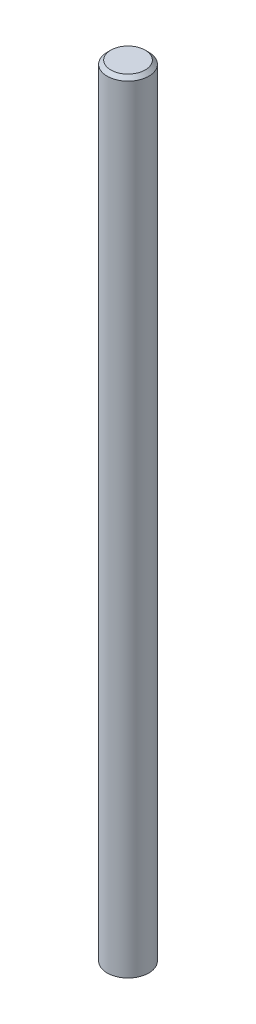
ISO-10303-21;
HEADER;
FILE_DESCRIPTION(('STEP AP214'),'2;1');
FILE_NAME('part.step','',(''),(''),'','','');
FILE_SCHEMA(('AUTOMOTIVE_DESIGN { 1 0 10303 214 1 1 1 1 }'));
ENDSEC;
DATA;
#1=APPLICATION_CONTEXT('core data for automotive mechanical design processes');
#2=APPLICATION_PROTOCOL_DEFINITION('international standard','automotive_design',2000,#1);
#3=PRODUCT_CONTEXT('',#1,'mechanical');
#4=PRODUCT('Part','Part','',(#3));
#5=PRODUCT_RELATED_PRODUCT_CATEGORY('part','',(#4));
#6=PRODUCT_DEFINITION_FORMATION('','',#4);
#7=PRODUCT_DEFINITION_CONTEXT('part definition',#1,'design');
#8=PRODUCT_DEFINITION('design','',#6,#7);
#9=PRODUCT_DEFINITION_SHAPE('','',#8);
#10=(LENGTH_UNIT() NAMED_UNIT(*) SI_UNIT(.MILLI.,.METRE.));
#11=(NAMED_UNIT(*) PLANE_ANGLE_UNIT() SI_UNIT($,.RADIAN.));
#12=(NAMED_UNIT(*) SI_UNIT($,.STERADIAN.) SOLID_ANGLE_UNIT());
#13=UNCERTAINTY_MEASURE_WITH_UNIT(LENGTH_MEASURE(1.E-05),#10,'distance_accuracy_value','');
#14=(GEOMETRIC_REPRESENTATION_CONTEXT(3) GLOBAL_UNCERTAINTY_ASSIGNED_CONTEXT((#13)) GLOBAL_UNIT_ASSIGNED_CONTEXT((#10,
#11,#12)) REPRESENTATION_CONTEXT('',''));
#15=CARTESIAN_POINT('',(0.,0.,0.));
#16=DIRECTION('',(0.,0.,1.));
#17=DIRECTION('',(1.,0.,0.));
#18=AXIS2_PLACEMENT_3D('',#15,#16,#17);
#19=CARTESIAN_POINT('',(0.,150.,0.));
#20=DIRECTION('',(0.,-1.,0.));
#21=DIRECTION('',(0.,0.,-1.));
#22=AXIS2_PLACEMENT_3D('',#19,#20,#21);
#23=CYLINDRICAL_SURFACE('',#22,4.);
#24=CARTESIAN_POINT('',(0.,149.3095,0.));
#25=DIRECTION('',(0.,-1.,0.));
#26=DIRECTION('',(0.,0.,-1.));
#27=AXIS2_PLACEMENT_3D('',#24,#25,#26);
#28=CIRCLE('',#27,4.);
#29=CARTESIAN_POINT('',(0.,149.3095,-4.));
#30=VERTEX_POINT('',#29);
#31=EDGE_CURVE('E47',#30,#30,#28,.T.);
#32=ORIENTED_EDGE('',*,*,#31,.T.);
#33=EDGE_LOOP('',(#32));
#34=FACE_BOUND('',#33,.T.);
#35=CARTESIAN_POINT('',(0.,0.,0.));
#36=DIRECTION('',(0.,1.,0.));
#37=DIRECTION('',(0.,0.,1.));
#38=AXIS2_PLACEMENT_3D('',#35,#36,#37);
#39=CIRCLE('',#38,4.);
#40=CARTESIAN_POINT('',(0.,0.,4.));
#41=VERTEX_POINT('',#40);
#42=EDGE_CURVE('E10',#41,#41,#39,.T.);
#43=ORIENTED_EDGE('',*,*,#42,.T.);
#44=EDGE_LOOP('',(#43));
#45=FACE_BOUND('',#44,.T.);
#46=ADVANCED_FACE('F41',(#34,#45),#23,.T.);
#47=CARTESIAN_POINT('',(0.,0.,0.));
#48=DIRECTION('',(0.,1.,0.));
#49=DIRECTION('',(0.,0.,1.));
#50=AXIS2_PLACEMENT_3D('',#47,#48,#49);
#51=PLANE('',#50);
#52=ORIENTED_EDGE('',*,*,#42,.F.);
#53=EDGE_LOOP('',(#52));
#54=FACE_BOUND('',#53,.T.);
#55=ADVANCED_FACE('F66',(#54),#51,.F.);
#56=CARTESIAN_POINT('',(0.,150.,0.));
#57=DIRECTION('',(0.,-1.,0.));
#58=DIRECTION('',(0.,0.,-1.));
#59=AXIS2_PLACEMENT_3D('',#56,#57,#58);
#60=CONICAL_SURFACE('',#59,3.3095,0.785398163397458);
#61=ORIENTED_EDGE('',*,*,#31,.F.);
#62=EDGE_LOOP('',(#61));
#63=FACE_BOUND('',#62,.T.);
#64=CARTESIAN_POINT('',(0.,150.,0.));
#65=DIRECTION('',(0.,-1.,0.));
#66=DIRECTION('',(0.,0.,-1.));
#67=AXIS2_PLACEMENT_3D('',#64,#65,#66);
#68=CIRCLE('',#67,3.3095);
#69=CARTESIAN_POINT('',(0.,150.,-3.3095));
#70=VERTEX_POINT('',#69);
#71=EDGE_CURVE('E51',#70,#70,#68,.T.);
#72=ORIENTED_EDGE('',*,*,#71,.T.);
#73=EDGE_LOOP('',(#72));
#74=FACE_BOUND('',#73,.T.);
#75=ADVANCED_FACE('F58',(#63,#74),#60,.T.);
#76=CARTESIAN_POINT('',(0.,150.,0.));
#77=DIRECTION('',(0.,1.,0.));
#78=DIRECTION('',(0.,0.,1.));
#79=AXIS2_PLACEMENT_3D('',#76,#77,#78);
#80=PLANE('',#79);
#81=ORIENTED_EDGE('',*,*,#71,.F.);
#82=EDGE_LOOP('',(#81));
#83=FACE_BOUND('',#82,.T.);
#84=ADVANCED_FACE('F60',(#83),#80,.T.);
#85=CLOSED_SHELL('',(#46,#55,#75,#84));
#86=MANIFOLD_SOLID_BREP('B2',#85);
#87=ADVANCED_BREP_SHAPE_REPRESENTATION('',(#18,#86),#14);
#88=SHAPE_DEFINITION_REPRESENTATION(#9,#87);
ENDSEC;
END-ISO-10303-21;
